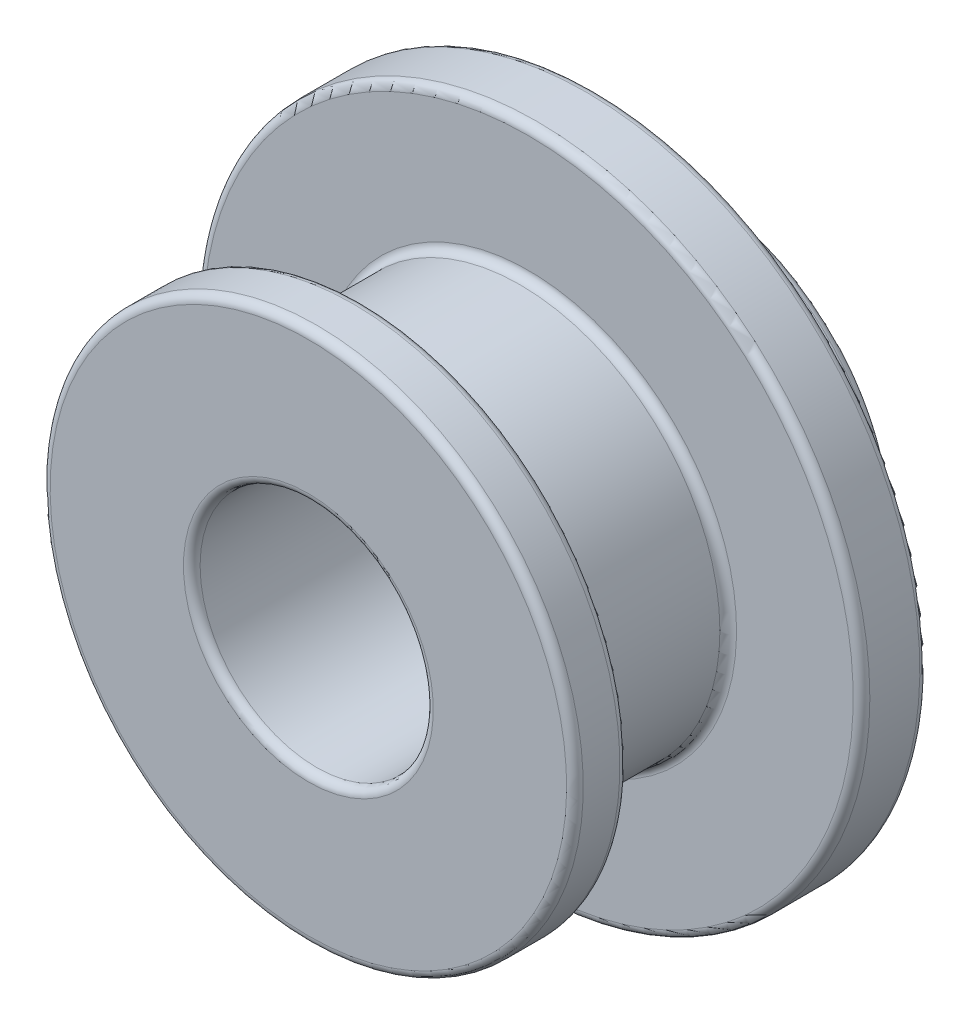
ISO-10303-21;
HEADER;
FILE_DESCRIPTION(('STEP AP214'),'2;1');
FILE_NAME('part.step','',(''),(''),'','','');
FILE_SCHEMA(('AUTOMOTIVE_DESIGN { 1 0 10303 214 1 1 1 1 }'));
ENDSEC;
DATA;
#1=APPLICATION_CONTEXT('core data for automotive mechanical design processes');
#2=APPLICATION_PROTOCOL_DEFINITION('international standard','automotive_design',2000,#1);
#3=PRODUCT_CONTEXT('',#1,'mechanical');
#4=PRODUCT('Part','Part','',(#3));
#5=PRODUCT_RELATED_PRODUCT_CATEGORY('part','',(#4));
#6=PRODUCT_DEFINITION_FORMATION('','',#4);
#7=PRODUCT_DEFINITION_CONTEXT('part definition',#1,'design');
#8=PRODUCT_DEFINITION('design','',#6,#7);
#9=PRODUCT_DEFINITION_SHAPE('','',#8);
#10=(LENGTH_UNIT() NAMED_UNIT(*) SI_UNIT(.MILLI.,.METRE.));
#11=(NAMED_UNIT(*) PLANE_ANGLE_UNIT() SI_UNIT($,.RADIAN.));
#12=(NAMED_UNIT(*) SI_UNIT($,.STERADIAN.) SOLID_ANGLE_UNIT());
#13=UNCERTAINTY_MEASURE_WITH_UNIT(LENGTH_MEASURE(1.E-05),#10,'distance_accuracy_value','');
#14=(GEOMETRIC_REPRESENTATION_CONTEXT(3) GLOBAL_UNCERTAINTY_ASSIGNED_CONTEXT((#13)) GLOBAL_UNIT_ASSIGNED_CONTEXT((#10,
#11,#12)) REPRESENTATION_CONTEXT('',''));
#15=CARTESIAN_POINT('',(0.,0.,0.));
#16=DIRECTION('',(0.,0.,1.));
#17=DIRECTION('',(1.,0.,0.));
#18=AXIS2_PLACEMENT_3D('',#15,#16,#17);
#19=CARTESIAN_POINT('',(0.,0.,-10.));
#20=DIRECTION('',(0.,0.,-1.));
#21=DIRECTION('',(0.,1.,0.));
#22=AXIS2_PLACEMENT_3D('',#19,#20,#21);
#23=CYLINDRICAL_SURFACE('',#22,8.);
#24=CARTESIAN_POINT('',(0.,0.,0.249999999999999));
#25=DIRECTION('',(0.,0.,-1.));
#26=DIRECTION('',(0.,1.,0.));
#27=AXIS2_PLACEMENT_3D('',#24,#25,#26);
#28=CIRCLE('',#27,8.);
#29=CARTESIAN_POINT('',(0.,8.,0.249999999999999));
#30=VERTEX_POINT('',#29);
#31=EDGE_CURVE('E54',#30,#30,#28,.F.);
#32=ORIENTED_EDGE('',*,*,#31,.T.);
#33=EDGE_LOOP('',(#32));
#34=FACE_BOUND('',#33,.T.);
#35=CARTESIAN_POINT('',(0.,0.,1.35));
#36=DIRECTION('',(0.,0.,1.));
#37=DIRECTION('',(0.,-1.,0.));
#38=AXIS2_PLACEMENT_3D('',#35,#36,#37);
#39=CIRCLE('',#38,8.);
#40=CARTESIAN_POINT('',(0.,-8.,1.35));
#41=VERTEX_POINT('',#40);
#42=EDGE_CURVE('E59',#41,#41,#39,.F.);
#43=ORIENTED_EDGE('',*,*,#42,.T.);
#44=EDGE_LOOP('',(#43));
#45=FACE_BOUND('',#44,.T.);
#46=ADVANCED_FACE('F39',(#34,#45),#23,.T.);
#47=CARTESIAN_POINT('',(0.,8.,0.));
#48=DIRECTION('',(0.,0.,-1.));
#49=DIRECTION('',(0.,1.,0.));
#50=AXIS2_PLACEMENT_3D('',#47,#48,#49);
#51=PLANE('',#50);
#52=CARTESIAN_POINT('',(0.,0.,0.));
#53=DIRECTION('',(0.,0.,-1.));
#54=DIRECTION('',(0.,1.,0.));
#55=AXIS2_PLACEMENT_3D('',#52,#53,#54);
#56=CIRCLE('',#55,6.25);
#57=CARTESIAN_POINT('',(0.,6.25,0.));
#58=VERTEX_POINT('',#57);
#59=EDGE_CURVE('E62',#58,#58,#56,.F.);
#60=ORIENTED_EDGE('',*,*,#59,.T.);
#61=EDGE_LOOP('',(#60));
#62=FACE_BOUND('',#61,.T.);
#63=CARTESIAN_POINT('',(0.,0.,0.));
#64=DIRECTION('',(0.,0.,-1.));
#65=DIRECTION('',(0.,1.,0.));
#66=AXIS2_PLACEMENT_3D('',#63,#64,#65);
#67=CIRCLE('',#66,7.75);
#68=CARTESIAN_POINT('',(0.,7.75,0.));
#69=VERTEX_POINT('',#68);
#70=EDGE_CURVE('E65',#69,#69,#67,.T.);
#71=ORIENTED_EDGE('',*,*,#70,.T.);
#72=EDGE_LOOP('',(#71));
#73=FACE_BOUND('',#72,.T.);
#74=ADVANCED_FACE('F130',(#62,#73),#51,.T.);
#75=CARTESIAN_POINT('',(0.,0.,-10.));
#76=DIRECTION('',(0.,0.,-1.));
#77=DIRECTION('',(0.,1.,0.));
#78=AXIS2_PLACEMENT_3D('',#75,#76,#77);
#79=CYLINDRICAL_SURFACE('',#78,6.);
#80=CARTESIAN_POINT('',(0.,0.,-4.75));
#81=DIRECTION('',(0.,0.,1.));
#82=DIRECTION('',(0.,-1.,0.));
#83=AXIS2_PLACEMENT_3D('',#80,#81,#82);
#84=CIRCLE('',#83,6.);
#85=CARTESIAN_POINT('',(0.,-6.,-4.75));
#86=VERTEX_POINT('',#85);
#87=EDGE_CURVE('E68',#86,#86,#84,.T.);
#88=ORIENTED_EDGE('',*,*,#87,.T.);
#89=EDGE_LOOP('',(#88));
#90=FACE_BOUND('',#89,.T.);
#91=CARTESIAN_POINT('',(0.,0.,-0.250000000000002));
#92=DIRECTION('',(0.,0.,-1.));
#93=DIRECTION('',(0.,1.,0.));
#94=AXIS2_PLACEMENT_3D('',#91,#92,#93);
#95=CIRCLE('',#94,6.);
#96=CARTESIAN_POINT('',(0.,6.,-0.250000000000001));
#97=VERTEX_POINT('',#96);
#98=EDGE_CURVE('E71',#97,#97,#95,.T.);
#99=ORIENTED_EDGE('',*,*,#98,.T.);
#100=EDGE_LOOP('',(#99));
#101=FACE_BOUND('',#100,.T.);
#102=ADVANCED_FACE('F136',(#90,#101),#79,.T.);
#103=CARTESIAN_POINT('',(0.,6.,-5.));
#104=DIRECTION('',(0.,0.,1.));
#105=DIRECTION('',(0.,-1.,0.));
#106=AXIS2_PLACEMENT_3D('',#103,#104,#105);
#107=PLANE('',#106);
#108=CARTESIAN_POINT('',(0.,0.,-5.));
#109=DIRECTION('',(0.,0.,1.));
#110=DIRECTION('',(0.,-1.,0.));
#111=AXIS2_PLACEMENT_3D('',#108,#109,#110);
#112=CIRCLE('',#111,9.75);
#113=CARTESIAN_POINT('',(0.,-9.75,-5.));
#114=VERTEX_POINT('',#113);
#115=EDGE_CURVE('E74',#114,#114,#112,.T.);
#116=ORIENTED_EDGE('',*,*,#115,.T.);
#117=EDGE_LOOP('',(#116));
#118=FACE_BOUND('',#117,.T.);
#119=CARTESIAN_POINT('',(0.,0.,-5.));
#120=DIRECTION('',(0.,0.,1.));
#121=DIRECTION('',(0.,-1.,0.));
#122=AXIS2_PLACEMENT_3D('',#119,#120,#121);
#123=CIRCLE('',#122,6.25);
#124=CARTESIAN_POINT('',(0.,-6.25,-5.));
#125=VERTEX_POINT('',#124);
#126=EDGE_CURVE('E77',#125,#125,#123,.F.);
#127=ORIENTED_EDGE('',*,*,#126,.T.);
#128=EDGE_LOOP('',(#127));
#129=FACE_BOUND('',#128,.T.);
#130=ADVANCED_FACE('F281',(#118,#129),#107,.T.);
#131=CARTESIAN_POINT('',(0.,0.,-10.));
#132=DIRECTION('',(0.,0.,-1.));
#133=DIRECTION('',(0.,1.,0.));
#134=AXIS2_PLACEMENT_3D('',#131,#132,#133);
#135=CYLINDRICAL_SURFACE('',#134,10.);
#136=CARTESIAN_POINT('',(0.,0.,-6.75));
#137=DIRECTION('',(0.,0.,-1.));
#138=DIRECTION('',(0.,1.,0.));
#139=AXIS2_PLACEMENT_3D('',#136,#137,#138);
#140=CIRCLE('',#139,10.);
#141=CARTESIAN_POINT('',(0.,10.,-6.75));
#142=VERTEX_POINT('',#141);
#143=EDGE_CURVE('E80',#142,#142,#140,.F.);
#144=ORIENTED_EDGE('',*,*,#143,.T.);
#145=EDGE_LOOP('',(#144));
#146=FACE_BOUND('',#145,.T.);
#147=CARTESIAN_POINT('',(0.,0.,-5.25));
#148=DIRECTION('',(0.,0.,1.));
#149=DIRECTION('',(0.,-1.,0.));
#150=AXIS2_PLACEMENT_3D('',#147,#148,#149);
#151=CIRCLE('',#150,10.);
#152=CARTESIAN_POINT('',(0.,-10.,-5.25));
#153=VERTEX_POINT('',#152);
#154=EDGE_CURVE('E83',#153,#153,#151,.F.);
#155=ORIENTED_EDGE('',*,*,#154,.T.);
#156=EDGE_LOOP('',(#155));
#157=FACE_BOUND('',#156,.T.);
#158=ADVANCED_FACE('F271',(#146,#157),#135,.T.);
#159=CARTESIAN_POINT('',(0.,10.,-7.));
#160=DIRECTION('',(0.,0.,-1.));
#161=DIRECTION('',(0.,1.,0.));
#162=AXIS2_PLACEMENT_3D('',#159,#160,#161);
#163=PLANE('',#162);
#164=CARTESIAN_POINT('',(0.,0.,-7.));
#165=DIRECTION('',(0.,0.,-1.));
#166=DIRECTION('',(0.,1.,0.));
#167=AXIS2_PLACEMENT_3D('',#164,#165,#166);
#168=CIRCLE('',#167,6.25);
#169=CARTESIAN_POINT('',(0.,6.25,-7.));
#170=VERTEX_POINT('',#169);
#171=EDGE_CURVE('E86',#170,#170,#168,.F.);
#172=ORIENTED_EDGE('',*,*,#171,.T.);
#173=EDGE_LOOP('',(#172));
#174=FACE_BOUND('',#173,.T.);
#175=CARTESIAN_POINT('',(0.,0.,-7.));
#176=DIRECTION('',(0.,0.,-1.));
#177=DIRECTION('',(0.,1.,0.));
#178=AXIS2_PLACEMENT_3D('',#175,#176,#177);
#179=CIRCLE('',#178,9.75);
#180=CARTESIAN_POINT('',(0.,9.75,-7.));
#181=VERTEX_POINT('',#180);
#182=EDGE_CURVE('E89',#181,#181,#179,.T.);
#183=ORIENTED_EDGE('',*,*,#182,.T.);
#184=EDGE_LOOP('',(#183));
#185=FACE_BOUND('',#184,.T.);
#186=ADVANCED_FACE('F261',(#174,#185),#163,.T.);
#187=CARTESIAN_POINT('',(0.,0.,-10.));
#188=DIRECTION('',(0.,0.,-1.));
#189=DIRECTION('',(0.,1.,0.));
#190=AXIS2_PLACEMENT_3D('',#187,#188,#189);
#191=CYLINDRICAL_SURFACE('',#190,6.);
#192=CARTESIAN_POINT('',(0.,0.,-9.75));
#193=DIRECTION('',(0.,0.,-1.));
#194=DIRECTION('',(0.,1.,0.));
#195=AXIS2_PLACEMENT_3D('',#192,#193,#194);
#196=CIRCLE('',#195,6.);
#197=CARTESIAN_POINT('',(0.,6.,-9.75));
#198=VERTEX_POINT('',#197);
#199=EDGE_CURVE('E92',#198,#198,#196,.F.);
#200=ORIENTED_EDGE('',*,*,#199,.T.);
#201=EDGE_LOOP('',(#200));
#202=FACE_BOUND('',#201,.T.);
#203=CARTESIAN_POINT('',(0.,0.,-7.25));
#204=DIRECTION('',(0.,0.,-1.));
#205=DIRECTION('',(0.,1.,0.));
#206=AXIS2_PLACEMENT_3D('',#203,#204,#205);
#207=CIRCLE('',#206,6.);
#208=CARTESIAN_POINT('',(0.,6.,-7.25));
#209=VERTEX_POINT('',#208);
#210=EDGE_CURVE('E95',#209,#209,#207,.T.);
#211=ORIENTED_EDGE('',*,*,#210,.T.);
#212=EDGE_LOOP('',(#211));
#213=FACE_BOUND('',#212,.T.);
#214=ADVANCED_FACE('F251',(#202,#213),#191,.T.);
#215=CARTESIAN_POINT('',(0.,6.,-10.));
#216=DIRECTION('',(0.,0.,-1.));
#217=DIRECTION('',(0.,1.,0.));
#218=AXIS2_PLACEMENT_3D('',#215,#216,#217);
#219=PLANE('',#218);
#220=CARTESIAN_POINT('',(0.,0.,-10.));
#221=DIRECTION('',(0.,0.,-1.));
#222=DIRECTION('',(0.,1.,0.));
#223=AXIS2_PLACEMENT_3D('',#220,#221,#222);
#224=CIRCLE('',#223,5.75);
#225=CARTESIAN_POINT('',(0.,5.75,-10.));
#226=VERTEX_POINT('',#225);
#227=EDGE_CURVE('E98',#226,#226,#224,.T.);
#228=ORIENTED_EDGE('',*,*,#227,.T.);
#229=EDGE_LOOP('',(#228));
#230=FACE_BOUND('',#229,.T.);
#231=CARTESIAN_POINT('',(0.,0.,-10.));
#232=DIRECTION('',(0.,0.,-1.));
#233=DIRECTION('',(0.,1.,0.));
#234=AXIS2_PLACEMENT_3D('',#231,#232,#233);
#235=CIRCLE('',#234,2.5);
#236=CARTESIAN_POINT('',(0.,2.5,-10.));
#237=VERTEX_POINT('',#236);
#238=EDGE_CURVE('E104',#237,#237,#235,.T.);
#239=ORIENTED_EDGE('',*,*,#238,.F.);
#240=EDGE_LOOP('',(#239));
#241=FACE_BOUND('',#240,.T.);
#242=ADVANCED_FACE('F118',(#230,#241),#219,.T.);
#243=CARTESIAN_POINT('',(0.,0.,-5.));
#244=DIRECTION('',(0.,0.,1.));
#245=DIRECTION('',(0.,-1.,0.));
#246=AXIS2_PLACEMENT_3D('',#243,#244,#245);
#247=PLANE('',#246);
#248=CARTESIAN_POINT('',(0.,0.,-5.));
#249=DIRECTION('',(0.,0.,1.));
#250=DIRECTION('',(1.,0.,0.));
#251=AXIS2_PLACEMENT_3D('',#248,#249,#250);
#252=CIRCLE('',#251,2.5);
#253=CARTESIAN_POINT('',(2.5,0.,-5.));
#254=VERTEX_POINT('',#253);
#255=EDGE_CURVE('E107',#254,#254,#252,.T.);
#256=ORIENTED_EDGE('',*,*,#255,.F.);
#257=EDGE_LOOP('',(#256));
#258=FACE_BOUND('',#257,.T.);
#259=CARTESIAN_POINT('',(0.,0.,-5.));
#260=DIRECTION('',(0.,0.,-1.));
#261=DIRECTION('',(0.,1.,0.));
#262=AXIS2_PLACEMENT_3D('',#259,#260,#261);
#263=CIRCLE('',#262,3.5);
#264=CARTESIAN_POINT('',(0.,3.5,-5.));
#265=VERTEX_POINT('',#264);
#266=EDGE_CURVE('E101',#265,#265,#263,.T.);
#267=ORIENTED_EDGE('',*,*,#266,.F.);
#268=EDGE_LOOP('',(#267));
#269=FACE_BOUND('',#268,.T.);
#270=ADVANCED_FACE('F114',(#258,#269),#247,.T.);
#271=CARTESIAN_POINT('',(0.,0.,-10.));
#272=DIRECTION('',(0.,0.,-1.));
#273=DIRECTION('',(0.,1.,0.));
#274=AXIS2_PLACEMENT_3D('',#271,#272,#273);
#275=CYLINDRICAL_SURFACE('',#274,3.5);
#276=CARTESIAN_POINT('',(0.,0.,1.35));
#277=DIRECTION('',(0.,0.,1.));
#278=DIRECTION('',(0.,-1.,0.));
#279=AXIS2_PLACEMENT_3D('',#276,#277,#278);
#280=CIRCLE('',#279,3.5);
#281=CARTESIAN_POINT('',(0.,-3.5,1.35));
#282=VERTEX_POINT('',#281);
#283=EDGE_CURVE('E10',#282,#282,#280,.T.);
#284=ORIENTED_EDGE('',*,*,#283,.T.);
#285=EDGE_LOOP('',(#284));
#286=FACE_BOUND('',#285,.T.);
#287=ORIENTED_EDGE('',*,*,#266,.T.);
#288=EDGE_LOOP('',(#287));
#289=FACE_BOUND('',#288,.T.);
#290=ADVANCED_FACE('F117',(#286,#289),#275,.F.);
#291=CARTESIAN_POINT('',(0.,3.5,1.6));
#292=DIRECTION('',(0.,0.,1.));
#293=DIRECTION('',(0.,-1.,0.));
#294=AXIS2_PLACEMENT_3D('',#291,#292,#293);
#295=PLANE('',#294);
#296=CARTESIAN_POINT('',(0.,0.,1.6));
#297=DIRECTION('',(0.,0.,1.));
#298=DIRECTION('',(0.,-1.,0.));
#299=AXIS2_PLACEMENT_3D('',#296,#297,#298);
#300=CIRCLE('',#299,7.75);
#301=CARTESIAN_POINT('',(0.,-7.75,1.6));
#302=VERTEX_POINT('',#301);
#303=EDGE_CURVE('E46',#302,#302,#300,.T.);
#304=ORIENTED_EDGE('',*,*,#303,.T.);
#305=EDGE_LOOP('',(#304));
#306=FACE_BOUND('',#305,.T.);
#307=CARTESIAN_POINT('',(0.,0.,1.6));
#308=DIRECTION('',(0.,0.,1.));
#309=DIRECTION('',(0.,-1.,0.));
#310=AXIS2_PLACEMENT_3D('',#307,#308,#309);
#311=CIRCLE('',#310,3.75);
#312=CARTESIAN_POINT('',(0.,-3.75,1.6));
#313=VERTEX_POINT('',#312);
#314=EDGE_CURVE('E50',#313,#313,#311,.F.);
#315=ORIENTED_EDGE('',*,*,#314,.T.);
#316=EDGE_LOOP('',(#315));
#317=FACE_BOUND('',#316,.T.);
#318=ADVANCED_FACE('F123',(#306,#317),#295,.T.);
#319=CARTESIAN_POINT('',(0.,0.,-5.));
#320=DIRECTION('',(0.,0.,1.));
#321=DIRECTION('',(1.,0.,0.));
#322=AXIS2_PLACEMENT_3D('',#319,#320,#321);
#323=CYLINDRICAL_SURFACE('',#322,2.5);
#324=ORIENTED_EDGE('',*,*,#255,.T.);
#325=EDGE_LOOP('',(#324));
#326=FACE_BOUND('',#325,.T.);
#327=ORIENTED_EDGE('',*,*,#238,.T.);
#328=EDGE_LOOP('',(#327));
#329=FACE_BOUND('',#328,.T.);
#330=ADVANCED_FACE('F111',(#326,#329),#323,.F.);
#331=CARTESIAN_POINT('',(0.,0.,-9.75));
#332=DIRECTION('',(0.,0.,-1.));
#333=DIRECTION('',(0.,1.,0.));
#334=AXIS2_PLACEMENT_3D('',#331,#332,#333);
#335=TOROIDAL_SURFACE('',#334,5.75,0.25);
#336=ORIENTED_EDGE('',*,*,#199,.F.);
#337=EDGE_LOOP('',(#336));
#338=FACE_BOUND('',#337,.T.);
#339=ORIENTED_EDGE('',*,*,#227,.F.);
#340=EDGE_LOOP('',(#339));
#341=FACE_BOUND('',#340,.T.);
#342=ADVANCED_FACE('F142',(#338,#341),#335,.T.);
#343=CARTESIAN_POINT('',(0.,0.,-7.25));
#344=DIRECTION('',(0.,0.,-1.));
#345=DIRECTION('',(0.,1.,0.));
#346=AXIS2_PLACEMENT_3D('',#343,#344,#345);
#347=TOROIDAL_SURFACE('',#346,6.25,0.25);
#348=ORIENTED_EDGE('',*,*,#171,.F.);
#349=EDGE_LOOP('',(#348));
#350=FACE_BOUND('',#349,.T.);
#351=ORIENTED_EDGE('',*,*,#210,.F.);
#352=EDGE_LOOP('',(#351));
#353=FACE_BOUND('',#352,.T.);
#354=ADVANCED_FACE('F145',(#350,#353),#347,.F.);
#355=CARTESIAN_POINT('',(0.,0.,-6.75));
#356=DIRECTION('',(0.,0.,-1.));
#357=DIRECTION('',(0.,1.,0.));
#358=AXIS2_PLACEMENT_3D('',#355,#356,#357);
#359=TOROIDAL_SURFACE('',#358,9.75,0.25);
#360=ORIENTED_EDGE('',*,*,#143,.F.);
#361=EDGE_LOOP('',(#360));
#362=FACE_BOUND('',#361,.T.);
#363=ORIENTED_EDGE('',*,*,#182,.F.);
#364=EDGE_LOOP('',(#363));
#365=FACE_BOUND('',#364,.T.);
#366=ADVANCED_FACE('F149',(#362,#365),#359,.T.);
#367=CARTESIAN_POINT('',(0.,0.,-5.25));
#368=DIRECTION('',(0.,0.,1.));
#369=DIRECTION('',(0.,-1.,0.));
#370=AXIS2_PLACEMENT_3D('',#367,#368,#369);
#371=TOROIDAL_SURFACE('',#370,9.75,0.25);
#372=ORIENTED_EDGE('',*,*,#115,.F.);
#373=EDGE_LOOP('',(#372));
#374=FACE_BOUND('',#373,.T.);
#375=ORIENTED_EDGE('',*,*,#154,.F.);
#376=EDGE_LOOP('',(#375));
#377=FACE_BOUND('',#376,.T.);
#378=ADVANCED_FACE('F153',(#374,#377),#371,.T.);
#379=CARTESIAN_POINT('',(0.,0.,-4.75));
#380=DIRECTION('',(0.,0.,1.));
#381=DIRECTION('',(0.,-1.,0.));
#382=AXIS2_PLACEMENT_3D('',#379,#380,#381);
#383=TOROIDAL_SURFACE('',#382,6.25,0.25);
#384=ORIENTED_EDGE('',*,*,#87,.F.);
#385=EDGE_LOOP('',(#384));
#386=FACE_BOUND('',#385,.T.);
#387=ORIENTED_EDGE('',*,*,#126,.F.);
#388=EDGE_LOOP('',(#387));
#389=FACE_BOUND('',#388,.T.);
#390=ADVANCED_FACE('F157',(#386,#389),#383,.F.);
#391=CARTESIAN_POINT('',(0.,0.,-0.250000000000002));
#392=DIRECTION('',(0.,0.,-1.));
#393=DIRECTION('',(0.,1.,0.));
#394=AXIS2_PLACEMENT_3D('',#391,#392,#393);
#395=TOROIDAL_SURFACE('',#394,6.25,0.25);
#396=ORIENTED_EDGE('',*,*,#59,.F.);
#397=EDGE_LOOP('',(#396));
#398=FACE_BOUND('',#397,.T.);
#399=ORIENTED_EDGE('',*,*,#98,.F.);
#400=EDGE_LOOP('',(#399));
#401=FACE_BOUND('',#400,.T.);
#402=ADVANCED_FACE('F161',(#398,#401),#395,.F.);
#403=CARTESIAN_POINT('',(0.,0.,0.249999999999999));
#404=DIRECTION('',(0.,0.,-1.));
#405=DIRECTION('',(0.,1.,0.));
#406=AXIS2_PLACEMENT_3D('',#403,#404,#405);
#407=TOROIDAL_SURFACE('',#406,7.75,0.25);
#408=ORIENTED_EDGE('',*,*,#31,.F.);
#409=EDGE_LOOP('',(#408));
#410=FACE_BOUND('',#409,.T.);
#411=ORIENTED_EDGE('',*,*,#70,.F.);
#412=EDGE_LOOP('',(#411));
#413=FACE_BOUND('',#412,.T.);
#414=ADVANCED_FACE('F165',(#410,#413),#407,.T.);
#415=CARTESIAN_POINT('',(0.,0.,1.35));
#416=DIRECTION('',(0.,0.,1.));
#417=DIRECTION('',(0.,-1.,0.));
#418=AXIS2_PLACEMENT_3D('',#415,#416,#417);
#419=TOROIDAL_SURFACE('',#418,7.75,0.25);
#420=ORIENTED_EDGE('',*,*,#303,.F.);
#421=EDGE_LOOP('',(#420));
#422=FACE_BOUND('',#421,.T.);
#423=ORIENTED_EDGE('',*,*,#42,.F.);
#424=EDGE_LOOP('',(#423));
#425=FACE_BOUND('',#424,.T.);
#426=ADVANCED_FACE('F168',(#422,#425),#419,.T.);
#427=CARTESIAN_POINT('',(0.,0.,1.35));
#428=DIRECTION('',(0.,0.,1.));
#429=DIRECTION('',(0.,-1.,0.));
#430=AXIS2_PLACEMENT_3D('',#427,#428,#429);
#431=TOROIDAL_SURFACE('',#430,3.75,0.25);
#432=ORIENTED_EDGE('',*,*,#283,.F.);
#433=EDGE_LOOP('',(#432));
#434=FACE_BOUND('',#433,.T.);
#435=ORIENTED_EDGE('',*,*,#314,.F.);
#436=EDGE_LOOP('',(#435));
#437=FACE_BOUND('',#436,.T.);
#438=ADVANCED_FACE('F41',(#434,#437),#431,.T.);
#439=CLOSED_SHELL('',(#46,#74,#102,#130,#158,#186,#214,#242,#270,#290,#318,#330,#342,#354,#366,
#378,#390,#402,#414,#426,#438));
#440=MANIFOLD_SOLID_BREP('B2',#439);
#441=ADVANCED_BREP_SHAPE_REPRESENTATION('',(#18,#440),#14);
#442=SHAPE_DEFINITION_REPRESENTATION(#9,#441);
ENDSEC;
END-ISO-10303-21;
